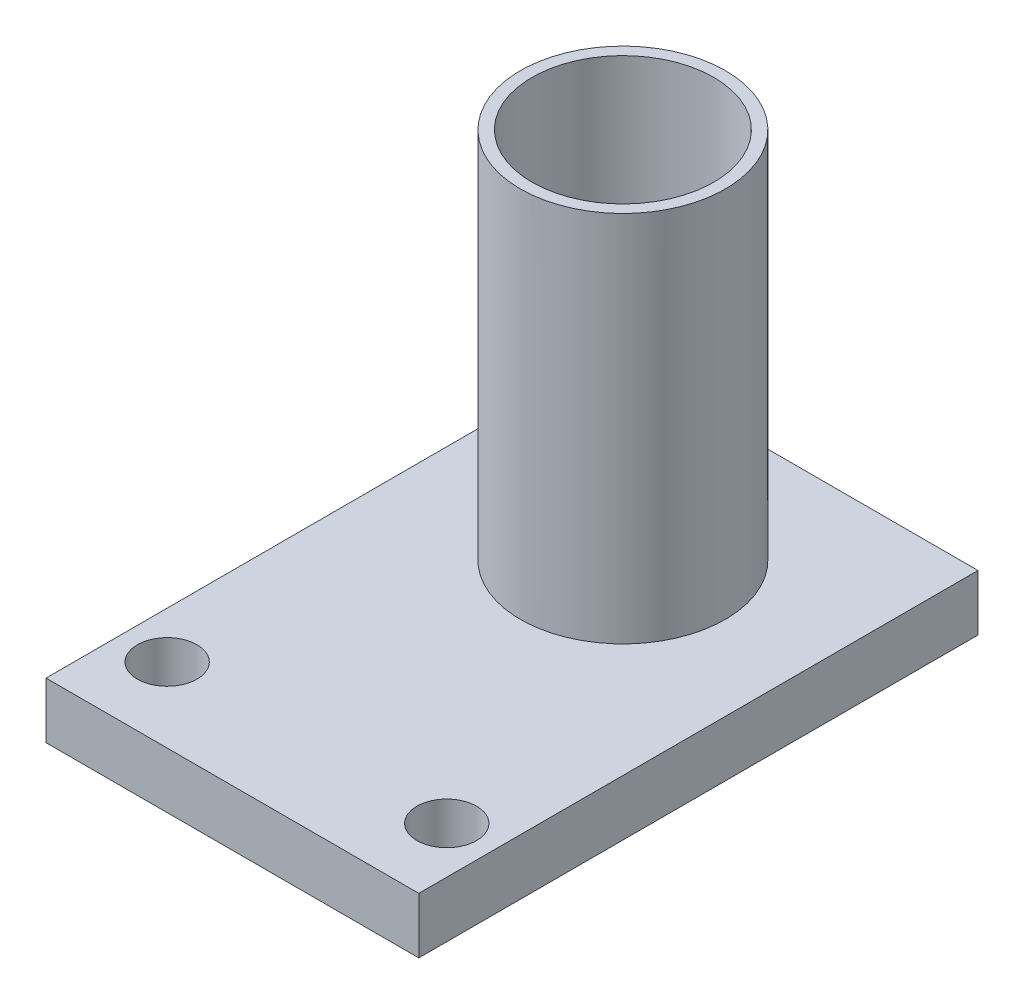
ISO-10303-21;
HEADER;
FILE_DESCRIPTION(('STEP AP214'),'2;1');
FILE_NAME('part.step','',(''),(''),'','','');
FILE_SCHEMA(('AUTOMOTIVE_DESIGN { 1 0 10303 214 1 1 1 1 }'));
ENDSEC;
DATA;
#1=APPLICATION_CONTEXT('core data for automotive mechanical design processes');
#2=APPLICATION_PROTOCOL_DEFINITION('international standard','automotive_design',2000,#1);
#3=PRODUCT_CONTEXT('',#1,'mechanical');
#4=PRODUCT('Part','Part','',(#3));
#5=PRODUCT_RELATED_PRODUCT_CATEGORY('part','',(#4));
#6=PRODUCT_DEFINITION_FORMATION('','',#4);
#7=PRODUCT_DEFINITION_CONTEXT('part definition',#1,'design');
#8=PRODUCT_DEFINITION('design','',#6,#7);
#9=PRODUCT_DEFINITION_SHAPE('','',#8);
#10=(LENGTH_UNIT() NAMED_UNIT(*) SI_UNIT(.MILLI.,.METRE.));
#11=(NAMED_UNIT(*) PLANE_ANGLE_UNIT() SI_UNIT($,.RADIAN.));
#12=(NAMED_UNIT(*) SI_UNIT($,.STERADIAN.) SOLID_ANGLE_UNIT());
#13=UNCERTAINTY_MEASURE_WITH_UNIT(LENGTH_MEASURE(1.E-05),#10,'distance_accuracy_value','');
#14=(GEOMETRIC_REPRESENTATION_CONTEXT(3) GLOBAL_UNCERTAINTY_ASSIGNED_CONTEXT((#13)) GLOBAL_UNIT_ASSIGNED_CONTEXT((#10,
#11,#12)) REPRESENTATION_CONTEXT('',''));
#15=CARTESIAN_POINT('',(0.,0.,0.));
#16=DIRECTION('',(0.,0.,1.));
#17=DIRECTION('',(1.,0.,0.));
#18=AXIS2_PLACEMENT_3D('',#15,#16,#17);
#19=CARTESIAN_POINT('',(0.,3.,0.));
#20=DIRECTION('',(0.,-1.,0.));
#21=DIRECTION('',(0.,0.,-1.));
#22=AXIS2_PLACEMENT_3D('',#19,#20,#21);
#23=PLANE('',#22);
#24=DIRECTION('',(0.,0.,-1.));
#25=VECTOR('',#24,1.);
#26=CARTESIAN_POINT('',(10.,3.,15.));
#27=LINE('',#26,#25);
#28=CARTESIAN_POINT('',(10.,3.,15.));
#29=VERTEX_POINT('',#28);
#30=CARTESIAN_POINT('',(10.,3.,-15.));
#31=VERTEX_POINT('',#30);
#32=EDGE_CURVE('E93',#29,#31,#27,.T.);
#33=ORIENTED_EDGE('',*,*,#32,.T.);
#34=DIRECTION('',(-1.,0.,0.));
#35=VECTOR('',#34,1.);
#36=CARTESIAN_POINT('',(-10.,3.,-15.));
#37=LINE('',#36,#35);
#38=CARTESIAN_POINT('',(-10.,3.,-15.));
#39=VERTEX_POINT('',#38);
#40=EDGE_CURVE('E88',#31,#39,#37,.T.);
#41=ORIENTED_EDGE('',*,*,#40,.T.);
#42=DIRECTION('',(0.,0.,1.));
#43=VECTOR('',#42,1.);
#44=CARTESIAN_POINT('',(-10.,3.,15.));
#45=LINE('',#44,#43);
#46=CARTESIAN_POINT('',(-10.,3.,15.));
#47=VERTEX_POINT('',#46);
#48=EDGE_CURVE('E91',#39,#47,#45,.T.);
#49=ORIENTED_EDGE('',*,*,#48,.T.);
#50=DIRECTION('',(1.,0.,0.));
#51=VECTOR('',#50,1.);
#52=CARTESIAN_POINT('',(-10.,3.,15.));
#53=LINE('',#52,#51);
#54=EDGE_CURVE('E57',#47,#29,#53,.T.);
#55=ORIENTED_EDGE('',*,*,#54,.T.);
#56=EDGE_LOOP('',(#33,#41,#49,#55));
#57=FACE_BOUND('',#56,.T.);
#58=CARTESIAN_POINT('',(7.5,3.,11.));
#59=DIRECTION('',(0.,1.,0.));
#60=DIRECTION('',(0.,0.,1.));
#61=AXIS2_PLACEMENT_3D('',#58,#59,#60);
#62=CIRCLE('',#61,1.6);
#63=CARTESIAN_POINT('',(7.5,3.,12.6));
#64=VERTEX_POINT('',#63);
#65=EDGE_CURVE('E193',#64,#64,#62,.T.);
#66=ORIENTED_EDGE('',*,*,#65,.F.);
#67=EDGE_LOOP('',(#66));
#68=FACE_BOUND('',#67,.T.);
#69=CARTESIAN_POINT('',(-7.5,3.,11.));
#70=DIRECTION('',(0.,1.,0.));
#71=DIRECTION('',(0.,0.,1.));
#72=AXIS2_PLACEMENT_3D('',#69,#70,#71);
#73=CIRCLE('',#72,1.6);
#74=CARTESIAN_POINT('',(-7.5,3.,12.6));
#75=VERTEX_POINT('',#74);
#76=EDGE_CURVE('E185',#75,#75,#73,.T.);
#77=ORIENTED_EDGE('',*,*,#76,.F.);
#78=EDGE_LOOP('',(#77));
#79=FACE_BOUND('',#78,.T.);
#80=CARTESIAN_POINT('',(0.,3.,-5.95));
#81=DIRECTION('',(0.,-1.,0.));
#82=DIRECTION('',(0.,0.,-1.));
#83=AXIS2_PLACEMENT_3D('',#80,#81,#82);
#84=CIRCLE('',#83,5.5);
#85=CARTESIAN_POINT('',(0.,3.,-11.45));
#86=VERTEX_POINT('',#85);
#87=EDGE_CURVE('E11',#86,#86,#84,.F.);
#88=ORIENTED_EDGE('',*,*,#87,.F.);
#89=EDGE_LOOP('',(#88));
#90=FACE_BOUND('',#89,.T.);
#91=ADVANCED_FACE('F39',(#57,#68,#79,#90),#23,.F.);
#92=CARTESIAN_POINT('',(10.,3.,15.));
#93=DIRECTION('',(-1.,0.,0.));
#94=DIRECTION('',(0.,0.,1.));
#95=AXIS2_PLACEMENT_3D('',#92,#93,#94);
#96=PLANE('',#95);
#97=DIRECTION('',(0.,0.,-1.));
#98=VECTOR('',#97,1.);
#99=CARTESIAN_POINT('',(10.,0.,15.));
#100=LINE('',#99,#98);
#101=CARTESIAN_POINT('',(10.,0.,15.));
#102=VERTEX_POINT('',#101);
#103=CARTESIAN_POINT('',(10.,0.,-15.));
#104=VERTEX_POINT('',#103);
#105=EDGE_CURVE('E111',#102,#104,#100,.T.);
#106=ORIENTED_EDGE('',*,*,#105,.T.);
#107=DIRECTION('',(0.,-1.,0.));
#108=VECTOR('',#107,1.);
#109=CARTESIAN_POINT('',(10.,3.,-15.));
#110=LINE('',#109,#108);
#111=EDGE_CURVE('E49',#31,#104,#110,.T.);
#112=ORIENTED_EDGE('',*,*,#111,.F.);
#113=ORIENTED_EDGE('',*,*,#32,.F.);
#114=DIRECTION('',(0.,-1.,0.));
#115=VECTOR('',#114,1.);
#116=CARTESIAN_POINT('',(10.,3.,15.));
#117=LINE('',#116,#115);
#118=EDGE_CURVE('E107',#29,#102,#117,.T.);
#119=ORIENTED_EDGE('',*,*,#118,.T.);
#120=EDGE_LOOP('',(#106,#112,#113,#119));
#121=FACE_BOUND('',#120,.T.);
#122=ADVANCED_FACE('F41',(#121),#96,.F.);
#123=CARTESIAN_POINT('',(-10.,3.,-15.));
#124=DIRECTION('',(0.,0.,1.));
#125=DIRECTION('',(1.,0.,0.));
#126=AXIS2_PLACEMENT_3D('',#123,#124,#125);
#127=PLANE('',#126);
#128=DIRECTION('',(-1.,0.,0.));
#129=VECTOR('',#128,1.);
#130=CARTESIAN_POINT('',(-10.,0.,-15.));
#131=LINE('',#130,#129);
#132=CARTESIAN_POINT('',(-10.,0.,-15.));
#133=VERTEX_POINT('',#132);
#134=EDGE_CURVE('E99',#104,#133,#131,.T.);
#135=ORIENTED_EDGE('',*,*,#134,.T.);
#136=DIRECTION('',(0.,-1.,0.));
#137=VECTOR('',#136,1.);
#138=CARTESIAN_POINT('',(-10.,3.,-15.));
#139=LINE('',#138,#137);
#140=EDGE_CURVE('E97',#39,#133,#139,.T.);
#141=ORIENTED_EDGE('',*,*,#140,.F.);
#142=ORIENTED_EDGE('',*,*,#40,.F.);
#143=ORIENTED_EDGE('',*,*,#111,.T.);
#144=EDGE_LOOP('',(#135,#141,#142,#143));
#145=FACE_BOUND('',#144,.T.);
#146=ADVANCED_FACE('F98',(#145),#127,.F.);
#147=CARTESIAN_POINT('',(-10.,3.,15.));
#148=DIRECTION('',(1.,0.,0.));
#149=DIRECTION('',(0.,0.,-1.));
#150=AXIS2_PLACEMENT_3D('',#147,#148,#149);
#151=PLANE('',#150);
#152=DIRECTION('',(0.,0.,1.));
#153=VECTOR('',#152,1.);
#154=CARTESIAN_POINT('',(-10.,0.,15.));
#155=LINE('',#154,#153);
#156=CARTESIAN_POINT('',(-10.,0.,15.));
#157=VERTEX_POINT('',#156);
#158=EDGE_CURVE('E74',#133,#157,#155,.T.);
#159=ORIENTED_EDGE('',*,*,#158,.T.);
#160=DIRECTION('',(0.,-1.,0.));
#161=VECTOR('',#160,1.);
#162=CARTESIAN_POINT('',(-10.,3.,15.));
#163=LINE('',#162,#161);
#164=EDGE_CURVE('E101',#47,#157,#163,.T.);
#165=ORIENTED_EDGE('',*,*,#164,.F.);
#166=ORIENTED_EDGE('',*,*,#48,.F.);
#167=ORIENTED_EDGE('',*,*,#140,.T.);
#168=EDGE_LOOP('',(#159,#165,#166,#167));
#169=FACE_BOUND('',#168,.T.);
#170=ADVANCED_FACE('F103',(#169),#151,.F.);
#171=CARTESIAN_POINT('',(-10.,3.,15.));
#172=DIRECTION('',(0.,0.,-1.));
#173=DIRECTION('',(-1.,0.,0.));
#174=AXIS2_PLACEMENT_3D('',#171,#172,#173);
#175=PLANE('',#174);
#176=DIRECTION('',(1.,0.,0.));
#177=VECTOR('',#176,1.);
#178=CARTESIAN_POINT('',(-10.,0.,15.));
#179=LINE('',#178,#177);
#180=EDGE_CURVE('E80',#157,#102,#179,.T.);
#181=ORIENTED_EDGE('',*,*,#180,.T.);
#182=ORIENTED_EDGE('',*,*,#118,.F.);
#183=ORIENTED_EDGE('',*,*,#54,.F.);
#184=ORIENTED_EDGE('',*,*,#164,.T.);
#185=EDGE_LOOP('',(#181,#182,#183,#184));
#186=FACE_BOUND('',#185,.T.);
#187=ADVANCED_FACE('F132',(#186),#175,.F.);
#188=CARTESIAN_POINT('',(0.,0.,0.));
#189=DIRECTION('',(0.,-1.,0.));
#190=DIRECTION('',(0.,0.,-1.));
#191=AXIS2_PLACEMENT_3D('',#188,#189,#190);
#192=PLANE('',#191);
#193=CARTESIAN_POINT('',(0.,0.,-5.95));
#194=DIRECTION('',(0.,-1.,0.));
#195=DIRECTION('',(0.,0.,-1.));
#196=AXIS2_PLACEMENT_3D('',#193,#194,#195);
#197=CIRCLE('',#196,4.875);
#198=CARTESIAN_POINT('',(0.,0.,-10.825));
#199=VERTEX_POINT('',#198);
#200=EDGE_CURVE('E180',#199,#199,#197,.F.);
#201=ORIENTED_EDGE('',*,*,#200,.T.);
#202=EDGE_LOOP('',(#201));
#203=FACE_BOUND('',#202,.T.);
#204=CARTESIAN_POINT('',(-7.5,0.,11.));
#205=DIRECTION('',(0.,-1.,0.));
#206=DIRECTION('',(0.,0.,-1.));
#207=AXIS2_PLACEMENT_3D('',#204,#205,#206);
#208=CIRCLE('',#207,1.6);
#209=CARTESIAN_POINT('',(-7.5,0.,9.4));
#210=VERTEX_POINT('',#209);
#211=EDGE_CURVE('E189',#210,#210,#208,.T.);
#212=ORIENTED_EDGE('',*,*,#211,.F.);
#213=EDGE_LOOP('',(#212));
#214=FACE_BOUND('',#213,.T.);
#215=CARTESIAN_POINT('',(7.5,0.,11.));
#216=DIRECTION('',(0.,-1.,0.));
#217=DIRECTION('',(0.,0.,-1.));
#218=AXIS2_PLACEMENT_3D('',#215,#216,#217);
#219=CIRCLE('',#218,1.6);
#220=CARTESIAN_POINT('',(7.5,0.,9.4));
#221=VERTEX_POINT('',#220);
#222=EDGE_CURVE('E115',#221,#221,#219,.T.);
#223=ORIENTED_EDGE('',*,*,#222,.F.);
#224=EDGE_LOOP('',(#223));
#225=FACE_BOUND('',#224,.T.);
#226=ORIENTED_EDGE('',*,*,#105,.F.);
#227=ORIENTED_EDGE('',*,*,#180,.F.);
#228=ORIENTED_EDGE('',*,*,#158,.F.);
#229=ORIENTED_EDGE('',*,*,#134,.F.);
#230=EDGE_LOOP('',(#226,#227,#228,#229));
#231=FACE_BOUND('',#230,.T.);
#232=ADVANCED_FACE('F129',(#203,#214,#225,#231),#192,.T.);
#233=CARTESIAN_POINT('',(7.5,3.,11.));
#234=DIRECTION('',(0.,1.,0.));
#235=DIRECTION('',(0.,0.,1.));
#236=AXIS2_PLACEMENT_3D('',#233,#234,#235);
#237=CYLINDRICAL_SURFACE('',#236,1.6);
#238=ORIENTED_EDGE('',*,*,#222,.T.);
#239=EDGE_LOOP('',(#238));
#240=FACE_BOUND('',#239,.T.);
#241=ORIENTED_EDGE('',*,*,#65,.T.);
#242=EDGE_LOOP('',(#241));
#243=FACE_BOUND('',#242,.T.);
#244=ADVANCED_FACE('F131',(#240,#243),#237,.F.);
#245=CARTESIAN_POINT('',(-7.5,3.,11.));
#246=DIRECTION('',(0.,1.,0.));
#247=DIRECTION('',(0.,0.,1.));
#248=AXIS2_PLACEMENT_3D('',#245,#246,#247);
#249=CYLINDRICAL_SURFACE('',#248,1.6);
#250=ORIENTED_EDGE('',*,*,#211,.T.);
#251=EDGE_LOOP('',(#250));
#252=FACE_BOUND('',#251,.T.);
#253=ORIENTED_EDGE('',*,*,#76,.T.);
#254=EDGE_LOOP('',(#253));
#255=FACE_BOUND('',#254,.T.);
#256=ADVANCED_FACE('F140',(#252,#255),#249,.F.);
#257=CARTESIAN_POINT('',(0.,-13.7885822331377,-5.95));
#258=DIRECTION('',(0.,1.,0.));
#259=DIRECTION('',(0.,0.,1.));
#260=AXIS2_PLACEMENT_3D('',#257,#258,#259);
#261=CYLINDRICAL_SURFACE('',#260,4.875);
#262=ORIENTED_EDGE('',*,*,#200,.F.);
#263=EDGE_LOOP('',(#262));
#264=FACE_BOUND('',#263,.T.);
#265=CARTESIAN_POINT('',(0.,23.,-5.95));
#266=DIRECTION('',(0.,1.,0.));
#267=DIRECTION('',(0.,0.,1.));
#268=AXIS2_PLACEMENT_3D('',#265,#266,#267);
#269=CIRCLE('',#268,4.875);
#270=CARTESIAN_POINT('',(0.,23.,-1.075));
#271=VERTEX_POINT('',#270);
#272=EDGE_CURVE('E175',#271,#271,#269,.T.);
#273=ORIENTED_EDGE('',*,*,#272,.T.);
#274=EDGE_LOOP('',(#273));
#275=FACE_BOUND('',#274,.T.);
#276=ADVANCED_FACE('F155',(#264,#275),#261,.F.);
#277=CARTESIAN_POINT('',(0.,23.,-5.95));
#278=DIRECTION('',(0.,1.,0.));
#279=DIRECTION('',(0.,0.,1.));
#280=AXIS2_PLACEMENT_3D('',#277,#278,#279);
#281=PLANE('',#280);
#282=CARTESIAN_POINT('',(0.,23.,-5.95));
#283=DIRECTION('',(0.,1.,0.));
#284=DIRECTION('',(0.,0.,1.));
#285=AXIS2_PLACEMENT_3D('',#282,#283,#284);
#286=CIRCLE('',#285,5.5);
#287=CARTESIAN_POINT('',(0.,23.,-0.450000000000001));
#288=VERTEX_POINT('',#287);
#289=EDGE_CURVE('E172',#288,#288,#286,.T.);
#290=ORIENTED_EDGE('',*,*,#289,.T.);
#291=EDGE_LOOP('',(#290));
#292=FACE_BOUND('',#291,.T.);
#293=ORIENTED_EDGE('',*,*,#272,.F.);
#294=EDGE_LOOP('',(#293));
#295=FACE_BOUND('',#294,.T.);
#296=ADVANCED_FACE('F159',(#292,#295),#281,.T.);
#297=CARTESIAN_POINT('',(0.,23.,-5.95));
#298=DIRECTION('',(0.,-1.,0.));
#299=DIRECTION('',(0.,0.,-1.));
#300=AXIS2_PLACEMENT_3D('',#297,#298,#299);
#301=CYLINDRICAL_SURFACE('',#300,5.5);
#302=ORIENTED_EDGE('',*,*,#289,.F.);
#303=EDGE_LOOP('',(#302));
#304=FACE_BOUND('',#303,.T.);
#305=ORIENTED_EDGE('',*,*,#87,.T.);
#306=EDGE_LOOP('',(#305));
#307=FACE_BOUND('',#306,.T.);
#308=ADVANCED_FACE('F161',(#304,#307),#301,.T.);
#309=CLOSED_SHELL('',(#91,#122,#146,#170,#187,#232,#244,#256,#276,#296,#308));
#310=MANIFOLD_SOLID_BREP('B2',#309);
#311=ADVANCED_BREP_SHAPE_REPRESENTATION('',(#18,#310),#14);
#312=SHAPE_DEFINITION_REPRESENTATION(#9,#311);
ENDSEC;
END-ISO-10303-21;
